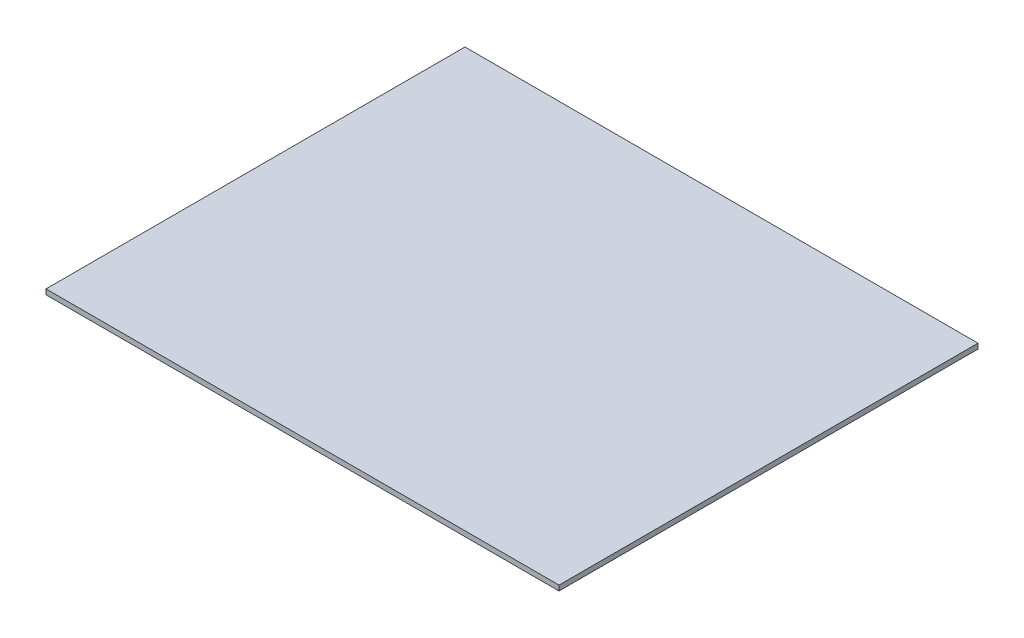
ISO-10303-21;
HEADER;
FILE_DESCRIPTION(('STEP AP214'),'2;1');
FILE_NAME('part.step','',(''),(''),'','','');
FILE_SCHEMA(('AUTOMOTIVE_DESIGN { 1 0 10303 214 1 1 1 1 }'));
ENDSEC;
DATA;
#1=APPLICATION_CONTEXT('core data for automotive mechanical design processes');
#2=APPLICATION_PROTOCOL_DEFINITION('international standard','automotive_design',2000,#1);
#3=PRODUCT_CONTEXT('',#1,'mechanical');
#4=PRODUCT('Part','Part','',(#3));
#5=PRODUCT_RELATED_PRODUCT_CATEGORY('part','',(#4));
#6=PRODUCT_DEFINITION_FORMATION('','',#4);
#7=PRODUCT_DEFINITION_CONTEXT('part definition',#1,'design');
#8=PRODUCT_DEFINITION('design','',#6,#7);
#9=PRODUCT_DEFINITION_SHAPE('','',#8);
#10=(LENGTH_UNIT() NAMED_UNIT(*) SI_UNIT(.MILLI.,.METRE.));
#11=(NAMED_UNIT(*) PLANE_ANGLE_UNIT() SI_UNIT($,.RADIAN.));
#12=(NAMED_UNIT(*) SI_UNIT($,.STERADIAN.) SOLID_ANGLE_UNIT());
#13=UNCERTAINTY_MEASURE_WITH_UNIT(LENGTH_MEASURE(1.E-05),#10,'distance_accuracy_value','');
#14=(GEOMETRIC_REPRESENTATION_CONTEXT(3) GLOBAL_UNCERTAINTY_ASSIGNED_CONTEXT((#13)) GLOBAL_UNIT_ASSIGNED_CONTEXT((#10,
#11,#12)) REPRESENTATION_CONTEXT('',''));
#15=CARTESIAN_POINT('',(0.,0.,0.));
#16=DIRECTION('',(0.,0.,1.));
#17=DIRECTION('',(1.,0.,0.));
#18=AXIS2_PLACEMENT_3D('',#15,#16,#17);
#19=CARTESIAN_POINT('',(-245.684210526316,3.,-79.8947368421053));
#20=DIRECTION('',(1.,0.,0.));
#21=DIRECTION('',(0.,0.,-1.));
#22=AXIS2_PLACEMENT_3D('',#19,#20,#21);
#23=PLANE('',#22);
#24=DIRECTION('',(0.,0.,1.));
#25=VECTOR('',#24,1.);
#26=CARTESIAN_POINT('',(-245.684210526316,0.,-79.8947368421053));
#27=LINE('',#26,#25);
#28=CARTESIAN_POINT('',(-245.684210526316,0.,-79.8947368421053));
#29=VERTEX_POINT('',#28);
#30=CARTESIAN_POINT('',(-245.684210526316,0.,165.105263157895));
#31=VERTEX_POINT('',#30);
#32=EDGE_CURVE('E96',#29,#31,#27,.T.);
#33=ORIENTED_EDGE('',*,*,#32,.T.);
#34=DIRECTION('',(0.,-1.,0.));
#35=VECTOR('',#34,1.);
#36=CARTESIAN_POINT('',(-245.684210526316,3.,165.105263157895));
#37=LINE('',#36,#35);
#38=CARTESIAN_POINT('',(-245.684210526316,3.,165.105263157895));
#39=VERTEX_POINT('',#38);
#40=EDGE_CURVE('E11',#39,#31,#37,.T.);
#41=ORIENTED_EDGE('',*,*,#40,.F.);
#42=DIRECTION('',(0.,0.,1.));
#43=VECTOR('',#42,1.);
#44=CARTESIAN_POINT('',(-245.684210526316,3.,-79.8947368421053));
#45=LINE('',#44,#43);
#46=CARTESIAN_POINT('',(-245.684210526316,3.,-79.8947368421053));
#47=VERTEX_POINT('',#46);
#48=EDGE_CURVE('E84',#47,#39,#45,.T.);
#49=ORIENTED_EDGE('',*,*,#48,.F.);
#50=DIRECTION('',(0.,-1.,0.));
#51=VECTOR('',#50,1.);
#52=CARTESIAN_POINT('',(-245.684210526316,3.,-79.8947368421053));
#53=LINE('',#52,#51);
#54=EDGE_CURVE('E92',#47,#29,#53,.T.);
#55=ORIENTED_EDGE('',*,*,#54,.T.);
#56=EDGE_LOOP('',(#33,#41,#49,#55));
#57=FACE_BOUND('',#56,.T.);
#58=ADVANCED_FACE('F33',(#57),#23,.F.);
#59=CARTESIAN_POINT('',(-245.684210526316,3.,165.105263157895));
#60=DIRECTION('',(0.,0.,-1.));
#61=DIRECTION('',(-1.,0.,0.));
#62=AXIS2_PLACEMENT_3D('',#59,#60,#61);
#63=PLANE('',#62);
#64=DIRECTION('',(1.,0.,0.));
#65=VECTOR('',#64,1.);
#66=CARTESIAN_POINT('',(-245.684210526316,0.,165.105263157895));
#67=LINE('',#66,#65);
#68=CARTESIAN_POINT('',(54.3157894736842,0.,165.105263157895));
#69=VERTEX_POINT('',#68);
#70=EDGE_CURVE('E88',#31,#69,#67,.T.);
#71=ORIENTED_EDGE('',*,*,#70,.T.);
#72=DIRECTION('',(0.,-1.,0.));
#73=VECTOR('',#72,1.);
#74=CARTESIAN_POINT('',(54.3157894736842,3.,165.105263157895));
#75=LINE('',#74,#73);
#76=CARTESIAN_POINT('',(54.3157894736842,3.,165.105263157895));
#77=VERTEX_POINT('',#76);
#78=EDGE_CURVE('E41',#77,#69,#75,.T.);
#79=ORIENTED_EDGE('',*,*,#78,.F.);
#80=DIRECTION('',(1.,0.,0.));
#81=VECTOR('',#80,1.);
#82=CARTESIAN_POINT('',(-245.684210526316,3.,165.105263157895));
#83=LINE('',#82,#81);
#84=EDGE_CURVE('E79',#39,#77,#83,.T.);
#85=ORIENTED_EDGE('',*,*,#84,.F.);
#86=ORIENTED_EDGE('',*,*,#40,.T.);
#87=EDGE_LOOP('',(#71,#79,#85,#86));
#88=FACE_BOUND('',#87,.T.);
#89=ADVANCED_FACE('F87',(#88),#63,.F.);
#90=CARTESIAN_POINT('',(54.3157894736842,3.,-79.8947368421053));
#91=DIRECTION('',(-1.,0.,0.));
#92=DIRECTION('',(0.,0.,1.));
#93=AXIS2_PLACEMENT_3D('',#90,#91,#92);
#94=PLANE('',#93);
#95=DIRECTION('',(0.,0.,-1.));
#96=VECTOR('',#95,1.);
#97=CARTESIAN_POINT('',(54.3157894736842,0.,-79.8947368421053));
#98=LINE('',#97,#96);
#99=CARTESIAN_POINT('',(54.3157894736842,0.,-79.8947368421053));
#100=VERTEX_POINT('',#99);
#101=EDGE_CURVE('E66',#69,#100,#98,.T.);
#102=ORIENTED_EDGE('',*,*,#101,.T.);
#103=DIRECTION('',(0.,-1.,0.));
#104=VECTOR('',#103,1.);
#105=CARTESIAN_POINT('',(54.3157894736842,3.,-79.8947368421053));
#106=LINE('',#105,#104);
#107=CARTESIAN_POINT('',(54.3157894736842,3.,-79.8947368421053));
#108=VERTEX_POINT('',#107);
#109=EDGE_CURVE('E89',#108,#100,#106,.T.);
#110=ORIENTED_EDGE('',*,*,#109,.F.);
#111=DIRECTION('',(0.,0.,-1.));
#112=VECTOR('',#111,1.);
#113=CARTESIAN_POINT('',(54.3157894736842,3.,-79.8947368421053));
#114=LINE('',#113,#112);
#115=EDGE_CURVE('E82',#77,#108,#114,.T.);
#116=ORIENTED_EDGE('',*,*,#115,.F.);
#117=ORIENTED_EDGE('',*,*,#78,.T.);
#118=EDGE_LOOP('',(#102,#110,#116,#117));
#119=FACE_BOUND('',#118,.T.);
#120=ADVANCED_FACE('F90',(#119),#94,.F.);
#121=CARTESIAN_POINT('',(-245.684210526316,3.,-79.8947368421053));
#122=DIRECTION('',(0.,0.,1.));
#123=DIRECTION('',(1.,0.,0.));
#124=AXIS2_PLACEMENT_3D('',#121,#122,#123);
#125=PLANE('',#124);
#126=DIRECTION('',(-1.,0.,0.));
#127=VECTOR('',#126,1.);
#128=CARTESIAN_POINT('',(-245.684210526316,0.,-79.8947368421053));
#129=LINE('',#128,#127);
#130=EDGE_CURVE('E72',#100,#29,#129,.T.);
#131=ORIENTED_EDGE('',*,*,#130,.T.);
#132=ORIENTED_EDGE('',*,*,#54,.F.);
#133=DIRECTION('',(-1.,0.,0.));
#134=VECTOR('',#133,1.);
#135=CARTESIAN_POINT('',(-245.684210526316,3.,-79.8947368421053));
#136=LINE('',#135,#134);
#137=EDGE_CURVE('E49',#108,#47,#136,.T.);
#138=ORIENTED_EDGE('',*,*,#137,.F.);
#139=ORIENTED_EDGE('',*,*,#109,.T.);
#140=EDGE_LOOP('',(#131,#132,#138,#139));
#141=FACE_BOUND('',#140,.T.);
#142=ADVANCED_FACE('F103',(#141),#125,.F.);
#143=CARTESIAN_POINT('',(0.,3.,0.));
#144=DIRECTION('',(0.,1.,0.));
#145=DIRECTION('',(0.,0.,1.));
#146=AXIS2_PLACEMENT_3D('',#143,#144,#145);
#147=PLANE('',#146);
#148=ORIENTED_EDGE('',*,*,#48,.T.);
#149=ORIENTED_EDGE('',*,*,#84,.T.);
#150=ORIENTED_EDGE('',*,*,#115,.T.);
#151=ORIENTED_EDGE('',*,*,#137,.T.);
#152=EDGE_LOOP('',(#148,#149,#150,#151));
#153=FACE_BOUND('',#152,.T.);
#154=ADVANCED_FACE('F80',(#153),#147,.T.);
#155=CARTESIAN_POINT('',(0.,0.,0.));
#156=DIRECTION('',(0.,1.,0.));
#157=DIRECTION('',(0.,0.,1.));
#158=AXIS2_PLACEMENT_3D('',#155,#156,#157);
#159=PLANE('',#158);
#160=ORIENTED_EDGE('',*,*,#32,.F.);
#161=ORIENTED_EDGE('',*,*,#130,.F.);
#162=ORIENTED_EDGE('',*,*,#101,.F.);
#163=ORIENTED_EDGE('',*,*,#70,.F.);
#164=EDGE_LOOP('',(#160,#161,#162,#163));
#165=FACE_BOUND('',#164,.T.);
#166=ADVANCED_FACE('F106',(#165),#159,.F.);
#167=CLOSED_SHELL('',(#58,#89,#120,#142,#154,#166));
#168=MANIFOLD_SOLID_BREP('B2',#167);
#169=ADVANCED_BREP_SHAPE_REPRESENTATION('',(#18,#168),#14);
#170=SHAPE_DEFINITION_REPRESENTATION(#9,#169);
ENDSEC;
END-ISO-10303-21;
